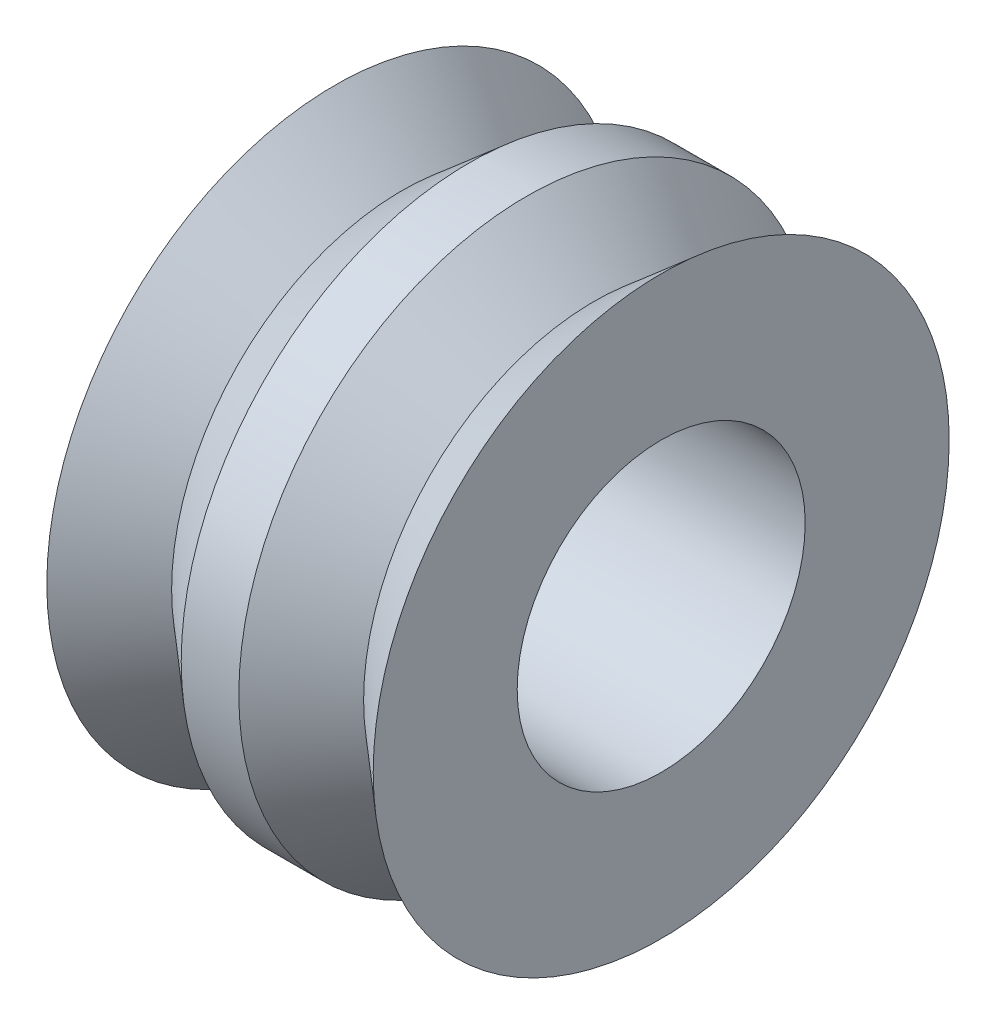
ISO-10303-21;
HEADER;
FILE_DESCRIPTION(('STEP AP214'),'2;1');
FILE_NAME('part.step','',(''),(''),'','','');
FILE_SCHEMA(('AUTOMOTIVE_DESIGN { 1 0 10303 214 1 1 1 1 }'));
ENDSEC;
DATA;
#1=APPLICATION_CONTEXT('core data for automotive mechanical design processes');
#2=APPLICATION_PROTOCOL_DEFINITION('international standard','automotive_design',2000,#1);
#3=PRODUCT_CONTEXT('',#1,'mechanical');
#4=PRODUCT('Part','Part','',(#3));
#5=PRODUCT_RELATED_PRODUCT_CATEGORY('part','',(#4));
#6=PRODUCT_DEFINITION_FORMATION('','',#4);
#7=PRODUCT_DEFINITION_CONTEXT('part definition',#1,'design');
#8=PRODUCT_DEFINITION('design','',#6,#7);
#9=PRODUCT_DEFINITION_SHAPE('','',#8);
#10=(LENGTH_UNIT() NAMED_UNIT(*) SI_UNIT(.MILLI.,.METRE.));
#11=(NAMED_UNIT(*) PLANE_ANGLE_UNIT() SI_UNIT($,.RADIAN.));
#12=(NAMED_UNIT(*) SI_UNIT($,.STERADIAN.) SOLID_ANGLE_UNIT());
#13=UNCERTAINTY_MEASURE_WITH_UNIT(LENGTH_MEASURE(1.E-05),#10,'distance_accuracy_value','');
#14=(GEOMETRIC_REPRESENTATION_CONTEXT(3) GLOBAL_UNCERTAINTY_ASSIGNED_CONTEXT((#13)) GLOBAL_UNIT_ASSIGNED_CONTEXT((#10,
#11,#12)) REPRESENTATION_CONTEXT('',''));
#15=CARTESIAN_POINT('',(0.,0.,0.));
#16=DIRECTION('',(0.,0.,1.));
#17=DIRECTION('',(1.,0.,0.));
#18=AXIS2_PLACEMENT_3D('',#15,#16,#17);
#19=CARTESIAN_POINT('',(-8.5,0.,0.));
#20=DIRECTION('',(1.,0.,0.));
#21=DIRECTION('',(0.,0.,-1.));
#22=AXIS2_PLACEMENT_3D('',#19,#20,#21);
#23=PLANE('',#22);
#24=CARTESIAN_POINT('',(-8.5,0.,0.));
#25=DIRECTION('',(-1.,0.,0.));
#26=DIRECTION('',(0.,0.,1.));
#27=AXIS2_PLACEMENT_3D('',#24,#25,#26);
#28=CIRCLE('',#27,7.49999999999999);
#29=CARTESIAN_POINT('',(-8.5,0.,7.49999999999999));
#30=VERTEX_POINT('',#29);
#31=EDGE_CURVE('E82',#30,#30,#28,.T.);
#32=ORIENTED_EDGE('',*,*,#31,.F.);
#33=EDGE_LOOP('',(#32));
#34=FACE_BOUND('',#33,.T.);
#35=CARTESIAN_POINT('',(-8.49999999999999,0.,0.));
#36=DIRECTION('',(-1.,0.,0.));
#37=DIRECTION('',(0.,0.,1.));
#38=AXIS2_PLACEMENT_3D('',#35,#36,#37);
#39=CIRCLE('',#38,15.);
#40=CARTESIAN_POINT('',(-8.49999999999999,0.,15.));
#41=VERTEX_POINT('',#40);
#42=EDGE_CURVE('E12',#41,#41,#39,.T.);
#43=ORIENTED_EDGE('',*,*,#42,.T.);
#44=EDGE_LOOP('',(#43));
#45=FACE_BOUND('',#44,.T.);
#46=ADVANCED_FACE('F46',(#34,#45),#23,.F.);
#47=CARTESIAN_POINT('',(-5.,0.,0.));
#48=DIRECTION('',(-1.,0.,0.));
#49=DIRECTION('',(0.,0.,1.));
#50=AXIS2_PLACEMENT_3D('',#47,#48,#49);
#51=CONICAL_SURFACE('',#50,12.,0.708626272127672);
#52=ORIENTED_EDGE('',*,*,#42,.F.);
#53=EDGE_LOOP('',(#52));
#54=FACE_BOUND('',#53,.T.);
#55=CARTESIAN_POINT('',(-5.,0.,0.));
#56=DIRECTION('',(-1.,0.,0.));
#57=DIRECTION('',(0.,0.,1.));
#58=AXIS2_PLACEMENT_3D('',#55,#56,#57);
#59=CIRCLE('',#58,12.);
#60=CARTESIAN_POINT('',(-5.,0.,12.));
#61=VERTEX_POINT('',#60);
#62=EDGE_CURVE('E53',#61,#61,#59,.T.);
#63=ORIENTED_EDGE('',*,*,#62,.T.);
#64=EDGE_LOOP('',(#63));
#65=FACE_BOUND('',#64,.T.);
#66=ADVANCED_FACE('F89',(#54,#65),#51,.T.);
#67=CARTESIAN_POINT('',(-1.5,0.,0.));
#68=DIRECTION('',(1.,0.,0.));
#69=DIRECTION('',(0.,0.,-1.));
#70=AXIS2_PLACEMENT_3D('',#67,#68,#69);
#71=CONICAL_SURFACE('',#70,15.,0.70862627212767);
#72=ORIENTED_EDGE('',*,*,#62,.F.);
#73=EDGE_LOOP('',(#72));
#74=FACE_BOUND('',#73,.T.);
#75=CARTESIAN_POINT('',(-1.5,0.,0.));
#76=DIRECTION('',(-1.,0.,0.));
#77=DIRECTION('',(0.,0.,1.));
#78=AXIS2_PLACEMENT_3D('',#75,#76,#77);
#79=CIRCLE('',#78,15.);
#80=CARTESIAN_POINT('',(-1.5,0.,15.));
#81=VERTEX_POINT('',#80);
#82=EDGE_CURVE('E59',#81,#81,#79,.T.);
#83=ORIENTED_EDGE('',*,*,#82,.T.);
#84=EDGE_LOOP('',(#83));
#85=FACE_BOUND('',#84,.T.);
#86=ADVANCED_FACE('F94',(#74,#85),#71,.T.);
#87=CARTESIAN_POINT('',(-85.1912800493008,0.,0.));
#88=DIRECTION('',(-1.,0.,0.));
#89=DIRECTION('',(0.,0.,1.));
#90=AXIS2_PLACEMENT_3D('',#87,#88,#89);
#91=CYLINDRICAL_SURFACE('',#90,15.);
#92=ORIENTED_EDGE('',*,*,#82,.F.);
#93=EDGE_LOOP('',(#92));
#94=FACE_BOUND('',#93,.T.);
#95=CARTESIAN_POINT('',(1.5,0.,0.));
#96=DIRECTION('',(-1.,0.,0.));
#97=DIRECTION('',(0.,0.,1.));
#98=AXIS2_PLACEMENT_3D('',#95,#96,#97);
#99=CIRCLE('',#98,15.);
#100=CARTESIAN_POINT('',(1.5,0.,15.));
#101=VERTEX_POINT('',#100);
#102=EDGE_CURVE('E64',#101,#101,#99,.T.);
#103=ORIENTED_EDGE('',*,*,#102,.T.);
#104=EDGE_LOOP('',(#103));
#105=FACE_BOUND('',#104,.T.);
#106=ADVANCED_FACE('F98',(#94,#105),#91,.T.);
#107=CARTESIAN_POINT('',(5.,0.,0.));
#108=DIRECTION('',(-1.,0.,0.));
#109=DIRECTION('',(0.,0.,1.));
#110=AXIS2_PLACEMENT_3D('',#107,#108,#109);
#111=CONICAL_SURFACE('',#110,12.,0.708626272127669);
#112=ORIENTED_EDGE('',*,*,#102,.F.);
#113=EDGE_LOOP('',(#112));
#114=FACE_BOUND('',#113,.T.);
#115=CARTESIAN_POINT('',(5.,0.,0.));
#116=DIRECTION('',(-1.,0.,0.));
#117=DIRECTION('',(0.,0.,1.));
#118=AXIS2_PLACEMENT_3D('',#115,#116,#117);
#119=CIRCLE('',#118,12.);
#120=CARTESIAN_POINT('',(5.,0.,12.));
#121=VERTEX_POINT('',#120);
#122=EDGE_CURVE('E70',#121,#121,#119,.T.);
#123=ORIENTED_EDGE('',*,*,#122,.T.);
#124=EDGE_LOOP('',(#123));
#125=FACE_BOUND('',#124,.T.);
#126=ADVANCED_FACE('F104',(#114,#125),#111,.T.);
#127=CARTESIAN_POINT('',(8.49999999999999,0.,0.));
#128=DIRECTION('',(1.,0.,0.));
#129=DIRECTION('',(0.,0.,-1.));
#130=AXIS2_PLACEMENT_3D('',#127,#128,#129);
#131=CONICAL_SURFACE('',#130,15.,0.708626272127671);
#132=ORIENTED_EDGE('',*,*,#122,.F.);
#133=EDGE_LOOP('',(#132));
#134=FACE_BOUND('',#133,.T.);
#135=CARTESIAN_POINT('',(8.49999999999999,0.,0.));
#136=DIRECTION('',(-1.,0.,0.));
#137=DIRECTION('',(0.,0.,1.));
#138=AXIS2_PLACEMENT_3D('',#135,#136,#137);
#139=CIRCLE('',#138,15.);
#140=CARTESIAN_POINT('',(8.49999999999999,0.,15.));
#141=VERTEX_POINT('',#140);
#142=EDGE_CURVE('E74',#141,#141,#139,.T.);
#143=ORIENTED_EDGE('',*,*,#142,.T.);
#144=EDGE_LOOP('',(#143));
#145=FACE_BOUND('',#144,.T.);
#146=ADVANCED_FACE('F108',(#134,#145),#131,.T.);
#147=CARTESIAN_POINT('',(8.5,15.,0.));
#148=DIRECTION('',(-1.,0.,0.));
#149=DIRECTION('',(0.,0.,1.));
#150=AXIS2_PLACEMENT_3D('',#147,#148,#149);
#151=PLANE('',#150);
#152=CARTESIAN_POINT('',(8.49999999999999,0.,0.));
#153=DIRECTION('',(-1.,0.,0.));
#154=DIRECTION('',(0.,0.,1.));
#155=AXIS2_PLACEMENT_3D('',#152,#153,#154);
#156=CIRCLE('',#155,7.5);
#157=CARTESIAN_POINT('',(8.49999999999999,0.,7.5));
#158=VERTEX_POINT('',#157);
#159=EDGE_CURVE('E78',#158,#158,#156,.T.);
#160=ORIENTED_EDGE('',*,*,#159,.T.);
#161=EDGE_LOOP('',(#160));
#162=FACE_BOUND('',#161,.T.);
#163=ORIENTED_EDGE('',*,*,#142,.F.);
#164=EDGE_LOOP('',(#163));
#165=FACE_BOUND('',#164,.T.);
#166=ADVANCED_FACE('F112',(#162,#165),#151,.F.);
#167=CARTESIAN_POINT('',(-8.5,0.,0.));
#168=DIRECTION('',(-1.,0.,0.));
#169=DIRECTION('',(0.,0.,1.));
#170=AXIS2_PLACEMENT_3D('',#167,#168,#169);
#171=CYLINDRICAL_SURFACE('',#170,7.49999999999999);
#172=ORIENTED_EDGE('',*,*,#159,.F.);
#173=EDGE_LOOP('',(#172));
#174=FACE_BOUND('',#173,.T.);
#175=ORIENTED_EDGE('',*,*,#31,.T.);
#176=EDGE_LOOP('',(#175));
#177=FACE_BOUND('',#176,.T.);
#178=ADVANCED_FACE('F86',(#174,#177),#171,.F.);
#179=CLOSED_SHELL('',(#46,#66,#86,#106,#126,#146,#166,#178));
#180=MANIFOLD_SOLID_BREP('B2',#179);
#181=ADVANCED_BREP_SHAPE_REPRESENTATION('',(#18,#180),#14);
#182=SHAPE_DEFINITION_REPRESENTATION(#9,#181);
ENDSEC;
END-ISO-10303-21;
